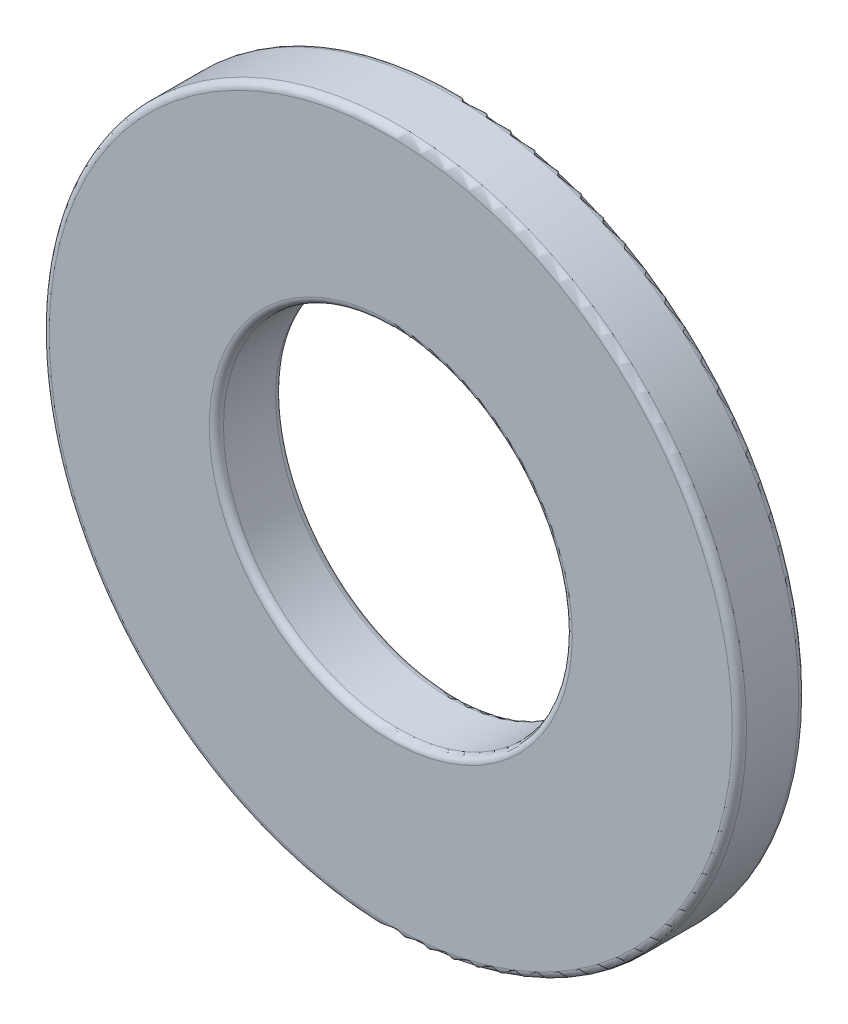
ISO-10303-21;
HEADER;
FILE_DESCRIPTION(('STEP AP214'),'2;1');
FILE_NAME('part.step','',(''),(''),'','','');
FILE_SCHEMA(('AUTOMOTIVE_DESIGN { 1 0 10303 214 1 1 1 1 }'));
ENDSEC;
DATA;
#1=APPLICATION_CONTEXT('core data for automotive mechanical design processes');
#2=APPLICATION_PROTOCOL_DEFINITION('international standard','automotive_design',2000,#1);
#3=PRODUCT_CONTEXT('',#1,'mechanical');
#4=PRODUCT('Part','Part','',(#3));
#5=PRODUCT_RELATED_PRODUCT_CATEGORY('part','',(#4));
#6=PRODUCT_DEFINITION_FORMATION('','',#4);
#7=PRODUCT_DEFINITION_CONTEXT('part definition',#1,'design');
#8=PRODUCT_DEFINITION('design','',#6,#7);
#9=PRODUCT_DEFINITION_SHAPE('','',#8);
#10=(LENGTH_UNIT() NAMED_UNIT(*) SI_UNIT(.MILLI.,.METRE.));
#11=(NAMED_UNIT(*) PLANE_ANGLE_UNIT() SI_UNIT($,.RADIAN.));
#12=(NAMED_UNIT(*) SI_UNIT($,.STERADIAN.) SOLID_ANGLE_UNIT());
#13=UNCERTAINTY_MEASURE_WITH_UNIT(LENGTH_MEASURE(1.E-05),#10,'distance_accuracy_value','');
#14=(GEOMETRIC_REPRESENTATION_CONTEXT(3) GLOBAL_UNCERTAINTY_ASSIGNED_CONTEXT((#13)) GLOBAL_UNIT_ASSIGNED_CONTEXT((#10,
#11,#12)) REPRESENTATION_CONTEXT('',''));
#15=CARTESIAN_POINT('',(0.,0.,0.));
#16=DIRECTION('',(0.,0.,1.));
#17=DIRECTION('',(1.,0.,0.));
#18=AXIS2_PLACEMENT_3D('',#15,#16,#17);
#19=CARTESIAN_POINT('',(0.,0.,-0.83185));
#20=DIRECTION('',(0.,0.,-1.));
#21=DIRECTION('',(1.,0.,0.));
#22=AXIS2_PLACEMENT_3D('',#19,#20,#21);
#23=PLANE('',#22);
#24=CARTESIAN_POINT('',(0.,0.,-0.83185));
#25=DIRECTION('',(0.,0.,1.));
#26=DIRECTION('',(1.,0.,0.));
#27=AXIS2_PLACEMENT_3D('',#24,#25,#26);
#28=CIRCLE('',#27,4.5466);
#29=CARTESIAN_POINT('',(4.5466,0.,-0.83185));
#30=VERTEX_POINT('',#29);
#31=EDGE_CURVE('E65',#30,#30,#28,.F.);
#32=ORIENTED_EDGE('',*,*,#31,.F.);
#33=EDGE_LOOP('',(#32));
#34=FACE_BOUND('',#33,.T.);
#35=CARTESIAN_POINT('',(0.,0.,-0.83185));
#36=DIRECTION('',(0.,0.,1.));
#37=DIRECTION('',(1.,0.,0.));
#38=AXIS2_PLACEMENT_3D('',#35,#36,#37);
#39=CIRCLE('',#38,8.55345);
#40=CARTESIAN_POINT('',(8.55345,0.,-0.83185));
#41=VERTEX_POINT('',#40);
#42=EDGE_CURVE('E68',#41,#41,#39,.T.);
#43=ORIENTED_EDGE('',*,*,#42,.F.);
#44=EDGE_LOOP('',(#43));
#45=FACE_BOUND('',#44,.T.);
#46=ADVANCED_FACE('F45',(#34,#45),#23,.T.);
#47=CARTESIAN_POINT('',(0.,0.,0.83185));
#48=DIRECTION('',(0.,0.,-1.));
#49=DIRECTION('',(1.,0.,0.));
#50=AXIS2_PLACEMENT_3D('',#47,#48,#49);
#51=PLANE('',#50);
#52=CARTESIAN_POINT('',(0.,0.,0.83185));
#53=DIRECTION('',(0.,0.,1.));
#54=DIRECTION('',(1.,0.,0.));
#55=AXIS2_PLACEMENT_3D('',#52,#53,#54);
#56=CIRCLE('',#55,4.5466);
#57=CARTESIAN_POINT('',(4.5466,0.,0.83185));
#58=VERTEX_POINT('',#57);
#59=EDGE_CURVE('E10',#58,#58,#56,.T.);
#60=ORIENTED_EDGE('',*,*,#59,.F.);
#61=EDGE_LOOP('',(#60));
#62=FACE_BOUND('',#61,.T.);
#63=CARTESIAN_POINT('',(0.,0.,0.83185));
#64=DIRECTION('',(0.,0.,1.));
#65=DIRECTION('',(1.,0.,0.));
#66=AXIS2_PLACEMENT_3D('',#63,#64,#65);
#67=CIRCLE('',#66,8.55345);
#68=CARTESIAN_POINT('',(8.55345,0.,0.83185));
#69=VERTEX_POINT('',#68);
#70=EDGE_CURVE('E52',#69,#69,#67,.F.);
#71=ORIENTED_EDGE('',*,*,#70,.F.);
#72=EDGE_LOOP('',(#71));
#73=FACE_BOUND('',#72,.T.);
#74=ADVANCED_FACE('F93',(#62,#73),#51,.F.);
#75=CARTESIAN_POINT('',(0.,0.,-0.83185));
#76=DIRECTION('',(0.,0.,1.));
#77=DIRECTION('',(-1.,0.,0.));
#78=AXIS2_PLACEMENT_3D('',#75,#76,#77);
#79=CYLINDRICAL_SURFACE('',#78,8.73125);
#80=CARTESIAN_POINT('',(0.,0.,-0.65405));
#81=DIRECTION('',(0.,0.,1.));
#82=DIRECTION('',(1.,0.,0.));
#83=AXIS2_PLACEMENT_3D('',#80,#81,#82);
#84=CIRCLE('',#83,8.73125);
#85=CARTESIAN_POINT('',(8.73125,0.,-0.65405));
#86=VERTEX_POINT('',#85);
#87=EDGE_CURVE('E56',#86,#86,#84,.F.);
#88=ORIENTED_EDGE('',*,*,#87,.F.);
#89=EDGE_LOOP('',(#88));
#90=FACE_BOUND('',#89,.T.);
#91=CARTESIAN_POINT('',(0.,0.,0.65405));
#92=DIRECTION('',(0.,0.,1.));
#93=DIRECTION('',(1.,0.,0.));
#94=AXIS2_PLACEMENT_3D('',#91,#92,#93);
#95=CIRCLE('',#94,8.73125);
#96=CARTESIAN_POINT('',(8.73125,0.,0.65405));
#97=VERTEX_POINT('',#96);
#98=EDGE_CURVE('E60',#97,#97,#95,.T.);
#99=ORIENTED_EDGE('',*,*,#98,.F.);
#100=EDGE_LOOP('',(#99));
#101=FACE_BOUND('',#100,.T.);
#102=ADVANCED_FACE('F83',(#90,#101),#79,.T.);
#103=CARTESIAN_POINT('',(0.,0.,-0.83185));
#104=DIRECTION('',(0.,0.,1.));
#105=DIRECTION('',(-1.,0.,0.));
#106=AXIS2_PLACEMENT_3D('',#103,#104,#105);
#107=CYLINDRICAL_SURFACE('',#106,4.3688);
#108=CARTESIAN_POINT('',(0.,0.,-0.65405));
#109=DIRECTION('',(0.,0.,1.));
#110=DIRECTION('',(1.,0.,0.));
#111=AXIS2_PLACEMENT_3D('',#108,#109,#110);
#112=CIRCLE('',#111,4.3688);
#113=CARTESIAN_POINT('',(4.3688,0.,-0.65405));
#114=VERTEX_POINT('',#113);
#115=EDGE_CURVE('E71',#114,#114,#112,.T.);
#116=ORIENTED_EDGE('',*,*,#115,.F.);
#117=EDGE_LOOP('',(#116));
#118=FACE_BOUND('',#117,.T.);
#119=CARTESIAN_POINT('',(0.,0.,0.65405));
#120=DIRECTION('',(0.,0.,1.));
#121=DIRECTION('',(1.,0.,0.));
#122=AXIS2_PLACEMENT_3D('',#119,#120,#121);
#123=CIRCLE('',#122,4.3688);
#124=CARTESIAN_POINT('',(4.3688,0.,0.65405));
#125=VERTEX_POINT('',#124);
#126=EDGE_CURVE('E74',#125,#125,#123,.F.);
#127=ORIENTED_EDGE('',*,*,#126,.F.);
#128=EDGE_LOOP('',(#127));
#129=FACE_BOUND('',#128,.T.);
#130=ADVANCED_FACE('F80',(#118,#129),#107,.F.);
#131=CARTESIAN_POINT('',(0.,0.,-0.65405));
#132=DIRECTION('',(0.,0.,-1.));
#133=DIRECTION('',(1.,0.,0.));
#134=AXIS2_PLACEMENT_3D('',#131,#132,#133);
#135=TOROIDAL_SURFACE('',#134,4.5466,0.1778);
#136=ORIENTED_EDGE('',*,*,#31,.T.);
#137=EDGE_LOOP('',(#136));
#138=FACE_BOUND('',#137,.T.);
#139=ORIENTED_EDGE('',*,*,#115,.T.);
#140=EDGE_LOOP('',(#139));
#141=FACE_BOUND('',#140,.T.);
#142=ADVANCED_FACE('F82',(#138,#141),#135,.T.);
#143=CARTESIAN_POINT('',(0.,0.,-0.65405));
#144=DIRECTION('',(0.,0.,-1.));
#145=DIRECTION('',(1.,0.,0.));
#146=AXIS2_PLACEMENT_3D('',#143,#144,#145);
#147=TOROIDAL_SURFACE('',#146,8.55345,0.1778);
#148=ORIENTED_EDGE('',*,*,#87,.T.);
#149=EDGE_LOOP('',(#148));
#150=FACE_BOUND('',#149,.T.);
#151=ORIENTED_EDGE('',*,*,#42,.T.);
#152=EDGE_LOOP('',(#151));
#153=FACE_BOUND('',#152,.T.);
#154=ADVANCED_FACE('F90',(#150,#153),#147,.T.);
#155=CARTESIAN_POINT('',(0.,0.,0.65405));
#156=DIRECTION('',(0.,0.,-1.));
#157=DIRECTION('',(1.,0.,0.));
#158=AXIS2_PLACEMENT_3D('',#155,#156,#157);
#159=TOROIDAL_SURFACE('',#158,4.5466,0.1778);
#160=ORIENTED_EDGE('',*,*,#126,.T.);
#161=EDGE_LOOP('',(#160));
#162=FACE_BOUND('',#161,.T.);
#163=ORIENTED_EDGE('',*,*,#59,.T.);
#164=EDGE_LOOP('',(#163));
#165=FACE_BOUND('',#164,.T.);
#166=ADVANCED_FACE('F78',(#162,#165),#159,.T.);
#167=CARTESIAN_POINT('',(0.,0.,0.65405));
#168=DIRECTION('',(0.,0.,-1.));
#169=DIRECTION('',(1.,0.,0.));
#170=AXIS2_PLACEMENT_3D('',#167,#168,#169);
#171=TOROIDAL_SURFACE('',#170,8.55345,0.1778);
#172=ORIENTED_EDGE('',*,*,#70,.T.);
#173=EDGE_LOOP('',(#172));
#174=FACE_BOUND('',#173,.T.);
#175=ORIENTED_EDGE('',*,*,#98,.T.);
#176=EDGE_LOOP('',(#175));
#177=FACE_BOUND('',#176,.T.);
#178=ADVANCED_FACE('F47',(#174,#177),#171,.T.);
#179=CLOSED_SHELL('',(#46,#74,#102,#130,#142,#154,#166,#178));
#180=MANIFOLD_SOLID_BREP('B2',#179);
#181=ADVANCED_BREP_SHAPE_REPRESENTATION('',(#18,#180),#14);
#182=SHAPE_DEFINITION_REPRESENTATION(#9,#181);
ENDSEC;
END-ISO-10303-21;
